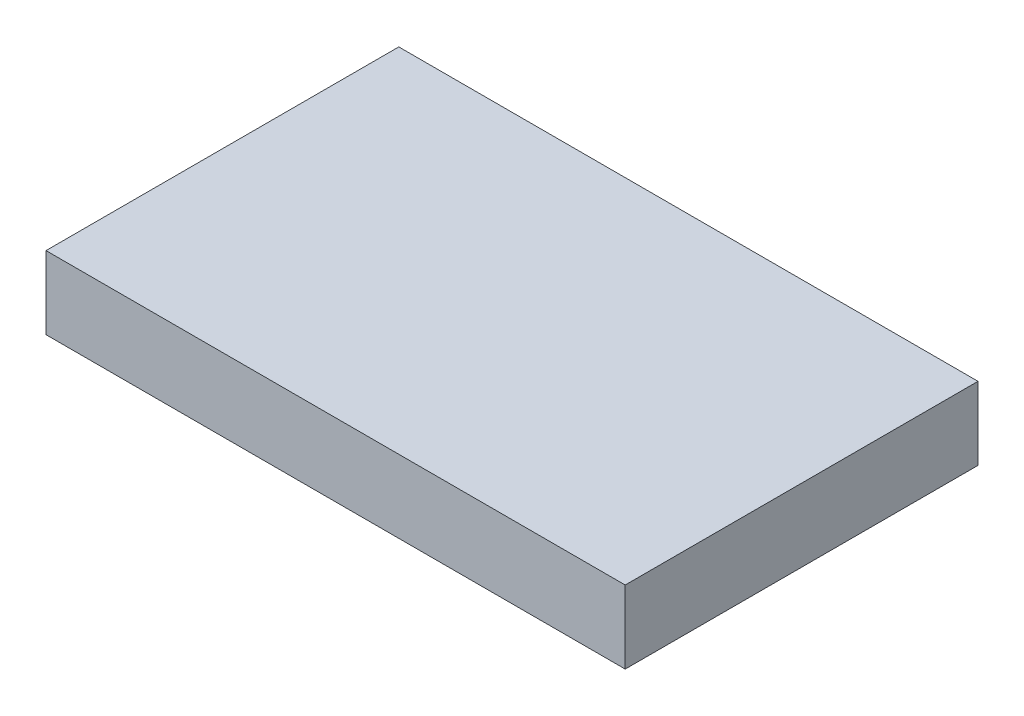
ISO-10303-21;
HEADER;
FILE_DESCRIPTION(('STEP AP214'),'2;1');
FILE_NAME('part.step','',(''),(''),'','','');
FILE_SCHEMA(('AUTOMOTIVE_DESIGN { 1 0 10303 214 1 1 1 1 }'));
ENDSEC;
DATA;
#1=APPLICATION_CONTEXT('core data for automotive mechanical design processes');
#2=APPLICATION_PROTOCOL_DEFINITION('international standard','automotive_design',2000,#1);
#3=PRODUCT_CONTEXT('',#1,'mechanical');
#4=PRODUCT('Part','Part','',(#3));
#5=PRODUCT_RELATED_PRODUCT_CATEGORY('part','',(#4));
#6=PRODUCT_DEFINITION_FORMATION('','',#4);
#7=PRODUCT_DEFINITION_CONTEXT('part definition',#1,'design');
#8=PRODUCT_DEFINITION('design','',#6,#7);
#9=PRODUCT_DEFINITION_SHAPE('','',#8);
#10=(LENGTH_UNIT() NAMED_UNIT(*) SI_UNIT(.MILLI.,.METRE.));
#11=(NAMED_UNIT(*) PLANE_ANGLE_UNIT() SI_UNIT($,.RADIAN.));
#12=(NAMED_UNIT(*) SI_UNIT($,.STERADIAN.) SOLID_ANGLE_UNIT());
#13=UNCERTAINTY_MEASURE_WITH_UNIT(LENGTH_MEASURE(1.E-05),#10,'distance_accuracy_value','');
#14=(GEOMETRIC_REPRESENTATION_CONTEXT(3) GLOBAL_UNCERTAINTY_ASSIGNED_CONTEXT((#13)) GLOBAL_UNIT_ASSIGNED_CONTEXT((#10,
#11,#12)) REPRESENTATION_CONTEXT('',''));
#15=CARTESIAN_POINT('',(0.,0.,0.));
#16=DIRECTION('',(0.,0.,1.));
#17=DIRECTION('',(1.,0.,0.));
#18=AXIS2_PLACEMENT_3D('',#15,#16,#17);
#19=CARTESIAN_POINT('',(-9.32843137254902,4.15,-4.09803921568625));
#20=DIRECTION('',(1.,0.,0.));
#21=DIRECTION('',(0.,0.,-1.));
#22=AXIS2_PLACEMENT_3D('',#19,#20,#21);
#23=PLANE('',#22);
#24=DIRECTION('',(0.,0.,1.));
#25=VECTOR('',#24,1.);
#26=CARTESIAN_POINT('',(-9.32843137254902,0.,-4.09803921568625));
#27=LINE('',#26,#25);
#28=CARTESIAN_POINT('',(-9.32843137254902,0.,-4.09803921568625));
#29=VERTEX_POINT('',#28);
#30=CARTESIAN_POINT('',(-9.32843137254902,0.,16.0019607843138));
#31=VERTEX_POINT('',#30);
#32=EDGE_CURVE('E100',#29,#31,#27,.T.);
#33=ORIENTED_EDGE('',*,*,#32,.T.);
#34=DIRECTION('',(0.,-1.,0.));
#35=VECTOR('',#34,1.);
#36=CARTESIAN_POINT('',(-9.32843137254902,4.15,16.0019607843138));
#37=LINE('',#36,#35);
#38=CARTESIAN_POINT('',(-9.32843137254902,4.15,16.0019607843138));
#39=VERTEX_POINT('',#38);
#40=EDGE_CURVE('E11',#39,#31,#37,.T.);
#41=ORIENTED_EDGE('',*,*,#40,.F.);
#42=DIRECTION('',(0.,0.,1.));
#43=VECTOR('',#42,1.);
#44=CARTESIAN_POINT('',(-9.32843137254902,4.15,-4.09803921568625));
#45=LINE('',#44,#43);
#46=CARTESIAN_POINT('',(-9.32843137254902,4.15,-4.09803921568625));
#47=VERTEX_POINT('',#46);
#48=EDGE_CURVE('E88',#47,#39,#45,.T.);
#49=ORIENTED_EDGE('',*,*,#48,.F.);
#50=DIRECTION('',(0.,-1.,0.));
#51=VECTOR('',#50,1.);
#52=CARTESIAN_POINT('',(-9.32843137254902,4.15,-4.09803921568625));
#53=LINE('',#52,#51);
#54=EDGE_CURVE('E96',#47,#29,#53,.T.);
#55=ORIENTED_EDGE('',*,*,#54,.T.);
#56=EDGE_LOOP('',(#33,#41,#49,#55));
#57=FACE_BOUND('',#56,.T.);
#58=ADVANCED_FACE('F37',(#57),#23,.F.);
#59=CARTESIAN_POINT('',(-9.32843137254902,4.15,16.0019607843138));
#60=DIRECTION('',(0.,0.,-1.));
#61=DIRECTION('',(-1.,0.,0.));
#62=AXIS2_PLACEMENT_3D('',#59,#60,#61);
#63=PLANE('',#62);
#64=DIRECTION('',(1.,0.,0.));
#65=VECTOR('',#64,1.);
#66=CARTESIAN_POINT('',(-9.32843137254902,0.,16.0019607843138));
#67=LINE('',#66,#65);
#68=CARTESIAN_POINT('',(23.671568627451,0.,16.0019607843138));
#69=VERTEX_POINT('',#68);
#70=EDGE_CURVE('E92',#31,#69,#67,.T.);
#71=ORIENTED_EDGE('',*,*,#70,.T.);
#72=DIRECTION('',(0.,-1.,0.));
#73=VECTOR('',#72,1.);
#74=CARTESIAN_POINT('',(23.671568627451,4.15,16.0019607843138));
#75=LINE('',#74,#73);
#76=CARTESIAN_POINT('',(23.671568627451,4.15,16.0019607843138));
#77=VERTEX_POINT('',#76);
#78=EDGE_CURVE('E45',#77,#69,#75,.T.);
#79=ORIENTED_EDGE('',*,*,#78,.F.);
#80=DIRECTION('',(1.,0.,0.));
#81=VECTOR('',#80,1.);
#82=CARTESIAN_POINT('',(-9.32843137254902,4.15,16.0019607843138));
#83=LINE('',#82,#81);
#84=EDGE_CURVE('E83',#39,#77,#83,.T.);
#85=ORIENTED_EDGE('',*,*,#84,.F.);
#86=ORIENTED_EDGE('',*,*,#40,.T.);
#87=EDGE_LOOP('',(#71,#79,#85,#86));
#88=FACE_BOUND('',#87,.T.);
#89=ADVANCED_FACE('F91',(#88),#63,.F.);
#90=CARTESIAN_POINT('',(23.671568627451,4.15,-4.09803921568625));
#91=DIRECTION('',(-1.,0.,0.));
#92=DIRECTION('',(0.,0.,1.));
#93=AXIS2_PLACEMENT_3D('',#90,#91,#92);
#94=PLANE('',#93);
#95=DIRECTION('',(0.,0.,-1.));
#96=VECTOR('',#95,1.);
#97=CARTESIAN_POINT('',(23.671568627451,0.,-4.09803921568625));
#98=LINE('',#97,#96);
#99=CARTESIAN_POINT('',(23.671568627451,0.,-4.09803921568625));
#100=VERTEX_POINT('',#99);
#101=EDGE_CURVE('E70',#69,#100,#98,.T.);
#102=ORIENTED_EDGE('',*,*,#101,.T.);
#103=DIRECTION('',(0.,-1.,0.));
#104=VECTOR('',#103,1.);
#105=CARTESIAN_POINT('',(23.671568627451,4.15,-4.09803921568625));
#106=LINE('',#105,#104);
#107=CARTESIAN_POINT('',(23.671568627451,4.15,-4.09803921568625));
#108=VERTEX_POINT('',#107);
#109=EDGE_CURVE('E93',#108,#100,#106,.T.);
#110=ORIENTED_EDGE('',*,*,#109,.F.);
#111=DIRECTION('',(0.,0.,-1.));
#112=VECTOR('',#111,1.);
#113=CARTESIAN_POINT('',(23.671568627451,4.15,-4.09803921568625));
#114=LINE('',#113,#112);
#115=EDGE_CURVE('E86',#77,#108,#114,.T.);
#116=ORIENTED_EDGE('',*,*,#115,.F.);
#117=ORIENTED_EDGE('',*,*,#78,.T.);
#118=EDGE_LOOP('',(#102,#110,#116,#117));
#119=FACE_BOUND('',#118,.T.);
#120=ADVANCED_FACE('F94',(#119),#94,.F.);
#121=CARTESIAN_POINT('',(-9.32843137254902,4.15,-4.09803921568625));
#122=DIRECTION('',(0.,0.,1.));
#123=DIRECTION('',(1.,0.,0.));
#124=AXIS2_PLACEMENT_3D('',#121,#122,#123);
#125=PLANE('',#124);
#126=DIRECTION('',(-1.,0.,0.));
#127=VECTOR('',#126,1.);
#128=CARTESIAN_POINT('',(-9.32843137254902,0.,-4.09803921568625));
#129=LINE('',#128,#127);
#130=EDGE_CURVE('E76',#100,#29,#129,.T.);
#131=ORIENTED_EDGE('',*,*,#130,.T.);
#132=ORIENTED_EDGE('',*,*,#54,.F.);
#133=DIRECTION('',(-1.,0.,0.));
#134=VECTOR('',#133,1.);
#135=CARTESIAN_POINT('',(-9.32843137254902,4.15,-4.09803921568625));
#136=LINE('',#135,#134);
#137=EDGE_CURVE('E53',#108,#47,#136,.T.);
#138=ORIENTED_EDGE('',*,*,#137,.F.);
#139=ORIENTED_EDGE('',*,*,#109,.T.);
#140=EDGE_LOOP('',(#131,#132,#138,#139));
#141=FACE_BOUND('',#140,.T.);
#142=ADVANCED_FACE('F107',(#141),#125,.F.);
#143=CARTESIAN_POINT('',(0.,4.15,0.));
#144=DIRECTION('',(0.,1.,0.));
#145=DIRECTION('',(0.,0.,1.));
#146=AXIS2_PLACEMENT_3D('',#143,#144,#145);
#147=PLANE('',#146);
#148=ORIENTED_EDGE('',*,*,#48,.T.);
#149=ORIENTED_EDGE('',*,*,#84,.T.);
#150=ORIENTED_EDGE('',*,*,#115,.T.);
#151=ORIENTED_EDGE('',*,*,#137,.T.);
#152=EDGE_LOOP('',(#148,#149,#150,#151));
#153=FACE_BOUND('',#152,.T.);
#154=ADVANCED_FACE('F84',(#153),#147,.T.);
#155=CARTESIAN_POINT('',(0.,0.,0.));
#156=DIRECTION('',(0.,1.,0.));
#157=DIRECTION('',(0.,0.,1.));
#158=AXIS2_PLACEMENT_3D('',#155,#156,#157);
#159=PLANE('',#158);
#160=ORIENTED_EDGE('',*,*,#32,.F.);
#161=ORIENTED_EDGE('',*,*,#130,.F.);
#162=ORIENTED_EDGE('',*,*,#101,.F.);
#163=ORIENTED_EDGE('',*,*,#70,.F.);
#164=EDGE_LOOP('',(#160,#161,#162,#163));
#165=FACE_BOUND('',#164,.T.);
#166=ADVANCED_FACE('F110',(#165),#159,.F.);
#167=CLOSED_SHELL('',(#58,#89,#120,#142,#154,#166));
#168=MANIFOLD_SOLID_BREP('B2',#167);
#169=ADVANCED_BREP_SHAPE_REPRESENTATION('',(#18,#168),#14);
#170=SHAPE_DEFINITION_REPRESENTATION(#9,#169);
ENDSEC;
END-ISO-10303-21;
